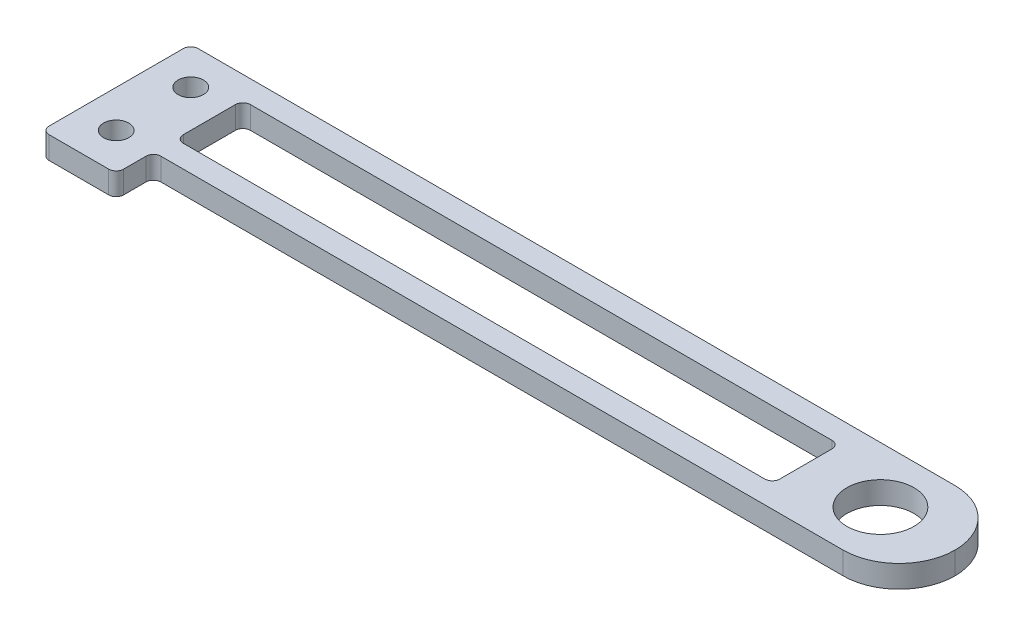
ISO-10303-21;
HEADER;
FILE_DESCRIPTION(('STEP AP214'),'2;1');
FILE_NAME('part.step','',(''),(''),'','','');
FILE_SCHEMA(('AUTOMOTIVE_DESIGN { 1 0 10303 214 1 1 1 1 }'));
ENDSEC;
DATA;
#1=APPLICATION_CONTEXT('core data for automotive mechanical design processes');
#2=APPLICATION_PROTOCOL_DEFINITION('international standard','automotive_design',2000,#1);
#3=PRODUCT_CONTEXT('',#1,'mechanical');
#4=PRODUCT('Part','Part','',(#3));
#5=PRODUCT_RELATED_PRODUCT_CATEGORY('part','',(#4));
#6=PRODUCT_DEFINITION_FORMATION('','',#4);
#7=PRODUCT_DEFINITION_CONTEXT('part definition',#1,'design');
#8=PRODUCT_DEFINITION('design','',#6,#7);
#9=PRODUCT_DEFINITION_SHAPE('','',#8);
#10=(LENGTH_UNIT() NAMED_UNIT(*) SI_UNIT(.MILLI.,.METRE.));
#11=(NAMED_UNIT(*) PLANE_ANGLE_UNIT() SI_UNIT($,.RADIAN.));
#12=(NAMED_UNIT(*) SI_UNIT($,.STERADIAN.) SOLID_ANGLE_UNIT());
#13=UNCERTAINTY_MEASURE_WITH_UNIT(LENGTH_MEASURE(1.E-05),#10,'distance_accuracy_value','');
#14=(GEOMETRIC_REPRESENTATION_CONTEXT(3) GLOBAL_UNCERTAINTY_ASSIGNED_CONTEXT((#13)) GLOBAL_UNIT_ASSIGNED_CONTEXT((#10,
#11,#12)) REPRESENTATION_CONTEXT('',''));
#15=CARTESIAN_POINT('',(0.,0.,0.));
#16=DIRECTION('',(0.,0.,1.));
#17=DIRECTION('',(1.,0.,0.));
#18=AXIS2_PLACEMENT_3D('',#15,#16,#17);
#19=CARTESIAN_POINT('',(10.,3.,0.));
#20=DIRECTION('',(0.,0.,-1.));
#21=DIRECTION('',(-1.,0.,0.));
#22=AXIS2_PLACEMENT_3D('',#19,#20,#21);
#23=PLANE('',#22);
#24=DIRECTION('',(1.,0.,0.));
#25=VECTOR('',#24,1.);
#26=CARTESIAN_POINT('',(10.,3.,0.));
#27=LINE('',#26,#25);
#28=CARTESIAN_POINT('',(0.999999999999999,3.,0.));
#29=VERTEX_POINT('',#28);
#30=CARTESIAN_POINT('',(9.,3.,0.));
#31=VERTEX_POINT('',#30);
#32=EDGE_CURVE('E183',#29,#31,#27,.T.);
#33=ORIENTED_EDGE('',*,*,#32,.F.);
#34=DIRECTION('',(0.,-1.,0.));
#35=VECTOR('',#34,1.);
#36=CARTESIAN_POINT('',(0.999999999999999,3.,0.));
#37=LINE('',#36,#35);
#38=CARTESIAN_POINT('',(0.999999999999999,0.,0.));
#39=VERTEX_POINT('',#38);
#40=EDGE_CURVE('E168',#29,#39,#37,.T.);
#41=ORIENTED_EDGE('',*,*,#40,.T.);
#42=DIRECTION('',(1.,0.,0.));
#43=VECTOR('',#42,1.);
#44=CARTESIAN_POINT('',(10.,0.,0.));
#45=LINE('',#44,#43);
#46=CARTESIAN_POINT('',(9.,0.,0.));
#47=VERTEX_POINT('',#46);
#48=EDGE_CURVE('E180',#39,#47,#45,.T.);
#49=ORIENTED_EDGE('',*,*,#48,.T.);
#50=DIRECTION('',(0.,-1.,0.));
#51=VECTOR('',#50,1.);
#52=CARTESIAN_POINT('',(9.,3.,0.));
#53=LINE('',#52,#51);
#54=EDGE_CURVE('E185',#47,#31,#53,.F.);
#55=ORIENTED_EDGE('',*,*,#54,.T.);
#56=EDGE_LOOP('',(#33,#41,#49,#55));
#57=FACE_BOUND('',#56,.T.);
#58=ADVANCED_FACE('F33',(#57),#23,.F.);
#59=CARTESIAN_POINT('',(9.99999999999999,3.,-4.99999999999999));
#60=DIRECTION('',(-1.,0.,0.));
#61=DIRECTION('',(0.,0.,1.));
#62=AXIS2_PLACEMENT_3D('',#59,#60,#61);
#63=PLANE('',#62);
#64=DIRECTION('',(0.,0.,-1.));
#65=VECTOR('',#64,1.);
#66=CARTESIAN_POINT('',(9.99999999999999,0.,-4.99999999999999));
#67=LINE('',#66,#65);
#68=CARTESIAN_POINT('',(10.,0.,-1.));
#69=VERTEX_POINT('',#68);
#70=CARTESIAN_POINT('',(10.,0.,-3.99999999999999));
#71=VERTEX_POINT('',#70);
#72=EDGE_CURVE('E190',#69,#71,#67,.T.);
#73=ORIENTED_EDGE('',*,*,#72,.T.);
#74=DIRECTION('',(0.,-1.,0.));
#75=VECTOR('',#74,1.);
#76=CARTESIAN_POINT('',(10.,3.,-3.99999999999999));
#77=LINE('',#76,#75);
#78=CARTESIAN_POINT('',(10.,3.,-3.99999999999999));
#79=VERTEX_POINT('',#78);
#80=EDGE_CURVE('E228',#71,#79,#77,.F.);
#81=ORIENTED_EDGE('',*,*,#80,.T.);
#82=DIRECTION('',(0.,0.,-1.));
#83=VECTOR('',#82,1.);
#84=CARTESIAN_POINT('',(9.99999999999999,3.,-4.99999999999999));
#85=LINE('',#84,#83);
#86=CARTESIAN_POINT('',(10.,3.,-1.));
#87=VERTEX_POINT('',#86);
#88=EDGE_CURVE('E335',#87,#79,#85,.T.);
#89=ORIENTED_EDGE('',*,*,#88,.F.);
#90=DIRECTION('',(0.,-1.,0.));
#91=VECTOR('',#90,1.);
#92=CARTESIAN_POINT('',(10.,3.,-1.));
#93=LINE('',#92,#91);
#94=EDGE_CURVE('E225',#87,#69,#93,.T.);
#95=ORIENTED_EDGE('',*,*,#94,.T.);
#96=EDGE_LOOP('',(#73,#81,#89,#95));
#97=FACE_BOUND('',#96,.T.);
#98=ADVANCED_FACE('F374',(#97),#63,.F.);
#99=CARTESIAN_POINT('',(110.,3.,-5.));
#100=DIRECTION('',(0.,0.,-1.));
#101=DIRECTION('',(-1.,0.,0.));
#102=AXIS2_PLACEMENT_3D('',#99,#100,#101);
#103=PLANE('',#102);
#104=DIRECTION('',(1.,0.,0.));
#105=VECTOR('',#104,1.);
#106=CARTESIAN_POINT('',(110.,0.,-5.));
#107=LINE('',#106,#105);
#108=CARTESIAN_POINT('',(11.,0.,-4.99999999999999));
#109=VERTEX_POINT('',#108);
#110=CARTESIAN_POINT('',(102.5,0.,-5.));
#111=VERTEX_POINT('',#110);
#112=EDGE_CURVE('E194',#109,#111,#107,.T.);
#113=ORIENTED_EDGE('',*,*,#112,.T.);
#114=DIRECTION('',(0.,-1.,0.));
#115=VECTOR('',#114,1.);
#116=CARTESIAN_POINT('',(102.5,3.,-5.));
#117=LINE('',#116,#115);
#118=CARTESIAN_POINT('',(102.5,3.,-5.));
#119=VERTEX_POINT('',#118);
#120=EDGE_CURVE('E248',#111,#119,#117,.F.);
#121=ORIENTED_EDGE('',*,*,#120,.T.);
#122=DIRECTION('',(1.,0.,0.));
#123=VECTOR('',#122,1.);
#124=CARTESIAN_POINT('',(110.,3.,-5.));
#125=LINE('',#124,#123);
#126=CARTESIAN_POINT('',(11.,3.,-4.99999999999999));
#127=VERTEX_POINT('',#126);
#128=EDGE_CURVE('E338',#127,#119,#125,.T.);
#129=ORIENTED_EDGE('',*,*,#128,.F.);
#130=DIRECTION('',(0.,-1.,0.));
#131=VECTOR('',#130,1.);
#132=CARTESIAN_POINT('',(11.,0.,-4.99999999999999));
#133=LINE('',#132,#131);
#134=EDGE_CURVE('E222',#127,#109,#133,.T.);
#135=ORIENTED_EDGE('',*,*,#134,.T.);
#136=EDGE_LOOP('',(#113,#121,#129,#135));
#137=FACE_BOUND('',#136,.T.);
#138=ADVANCED_FACE('F366',(#137),#103,.F.);
#139=CARTESIAN_POINT('',(0.,3.,-20.));
#140=DIRECTION('',(0.,0.,1.));
#141=DIRECTION('',(1.,0.,0.));
#142=AXIS2_PLACEMENT_3D('',#139,#140,#141);
#143=PLANE('',#142);
#144=DIRECTION('',(-1.,0.,0.));
#145=VECTOR('',#144,1.);
#146=CARTESIAN_POINT('',(0.,3.,-20.));
#147=LINE('',#146,#145);
#148=CARTESIAN_POINT('',(102.5,3.,-20.));
#149=VERTEX_POINT('',#148);
#150=CARTESIAN_POINT('',(1.,3.,-20.));
#151=VERTEX_POINT('',#150);
#152=EDGE_CURVE('E340',#149,#151,#147,.T.);
#153=ORIENTED_EDGE('',*,*,#152,.F.);
#154=DIRECTION('',(0.,-1.,0.));
#155=VECTOR('',#154,1.);
#156=CARTESIAN_POINT('',(102.5,3.,-20.));
#157=LINE('',#156,#155);
#158=CARTESIAN_POINT('',(102.5,0.,-20.));
#159=VERTEX_POINT('',#158);
#160=EDGE_CURVE('E237',#149,#159,#157,.T.);
#161=ORIENTED_EDGE('',*,*,#160,.T.);
#162=DIRECTION('',(-1.,0.,0.));
#163=VECTOR('',#162,1.);
#164=CARTESIAN_POINT('',(0.,0.,-20.));
#165=LINE('',#164,#163);
#166=CARTESIAN_POINT('',(1.,0.,-20.));
#167=VERTEX_POINT('',#166);
#168=EDGE_CURVE('E205',#159,#167,#165,.T.);
#169=ORIENTED_EDGE('',*,*,#168,.T.);
#170=DIRECTION('',(0.,-1.,0.));
#171=VECTOR('',#170,1.);
#172=CARTESIAN_POINT('',(1.,3.,-20.));
#173=LINE('',#172,#171);
#174=EDGE_CURVE('E230',#167,#151,#173,.F.);
#175=ORIENTED_EDGE('',*,*,#174,.T.);
#176=EDGE_LOOP('',(#153,#161,#169,#175));
#177=FACE_BOUND('',#176,.T.);
#178=ADVANCED_FACE('F354',(#177),#143,.F.);
#179=CARTESIAN_POINT('',(0.,3.,0.));
#180=DIRECTION('',(1.,0.,0.));
#181=DIRECTION('',(0.,0.,-1.));
#182=AXIS2_PLACEMENT_3D('',#179,#180,#181);
#183=PLANE('',#182);
#184=DIRECTION('',(0.,0.,1.));
#185=VECTOR('',#184,1.);
#186=CARTESIAN_POINT('',(0.,0.,0.));
#187=LINE('',#186,#185);
#188=CARTESIAN_POINT('',(0.,0.,-19.));
#189=VERTEX_POINT('',#188);
#190=CARTESIAN_POINT('',(0.,0.,-1.));
#191=VERTEX_POINT('',#190);
#192=EDGE_CURVE('E207',#189,#191,#187,.T.);
#193=ORIENTED_EDGE('',*,*,#192,.T.);
#194=DIRECTION('',(0.,-1.,0.));
#195=VECTOR('',#194,1.);
#196=CARTESIAN_POINT('',(0.,3.,-1.));
#197=LINE('',#196,#195);
#198=CARTESIAN_POINT('',(0.,3.,-1.));
#199=VERTEX_POINT('',#198);
#200=EDGE_CURVE('E169',#191,#199,#197,.F.);
#201=ORIENTED_EDGE('',*,*,#200,.T.);
#202=DIRECTION('',(0.,0.,1.));
#203=VECTOR('',#202,1.);
#204=CARTESIAN_POINT('',(0.,3.,0.));
#205=LINE('',#204,#203);
#206=CARTESIAN_POINT('',(0.,3.,-19.));
#207=VERTEX_POINT('',#206);
#208=EDGE_CURVE('E200',#207,#199,#205,.T.);
#209=ORIENTED_EDGE('',*,*,#208,.F.);
#210=DIRECTION('',(0.,-1.,0.));
#211=VECTOR('',#210,1.);
#212=CARTESIAN_POINT('',(0.,3.,-19.));
#213=LINE('',#212,#211);
#214=EDGE_CURVE('E174',#207,#189,#213,.T.);
#215=ORIENTED_EDGE('',*,*,#214,.T.);
#216=EDGE_LOOP('',(#193,#201,#209,#215));
#217=FACE_BOUND('',#216,.T.);
#218=ADVANCED_FACE('F348',(#217),#183,.F.);
#219=CARTESIAN_POINT('',(0.,3.,0.));
#220=DIRECTION('',(0.,-1.,0.));
#221=DIRECTION('',(0.,0.,-1.));
#222=AXIS2_PLACEMENT_3D('',#219,#220,#221);
#223=PLANE('',#222);
#224=DIRECTION('',(1.,0.,0.));
#225=VECTOR('',#224,1.);
#226=CARTESIAN_POINT('',(10.,3.,-7.99999999999999));
#227=LINE('',#226,#225);
#228=CARTESIAN_POINT('',(11.,3.,-7.99999999999999));
#229=VERTEX_POINT('',#228);
#230=CARTESIAN_POINT('',(89.,3.,-7.99999999999999));
#231=VERTEX_POINT('',#230);
#232=EDGE_CURVE('E316',#229,#231,#227,.T.);
#233=ORIENTED_EDGE('',*,*,#232,.F.);
#234=CARTESIAN_POINT('',(11.,3.,-8.99999999999999));
#235=DIRECTION('',(0.,-1.,0.));
#236=DIRECTION('',(0.,0.,-1.));
#237=AXIS2_PLACEMENT_3D('',#234,#235,#236);
#238=CIRCLE('',#237,1.);
#239=CARTESIAN_POINT('',(10.,3.,-8.99999999999999));
#240=VERTEX_POINT('',#239);
#241=EDGE_CURVE('E282',#229,#240,#238,.T.);
#242=ORIENTED_EDGE('',*,*,#241,.T.);
#243=DIRECTION('',(0.,0.,1.));
#244=VECTOR('',#243,1.);
#245=CARTESIAN_POINT('',(10.,3.,-17.));
#246=LINE('',#245,#244);
#247=CARTESIAN_POINT('',(10.,3.,-16.));
#248=VERTEX_POINT('',#247);
#249=EDGE_CURVE('E293',#248,#240,#246,.T.);
#250=ORIENTED_EDGE('',*,*,#249,.F.);
#251=CARTESIAN_POINT('',(11.,3.,-16.));
#252=DIRECTION('',(0.,-1.,0.));
#253=DIRECTION('',(0.,0.,-1.));
#254=AXIS2_PLACEMENT_3D('',#251,#252,#253);
#255=CIRCLE('',#254,1.);
#256=CARTESIAN_POINT('',(11.,3.,-17.));
#257=VERTEX_POINT('',#256);
#258=EDGE_CURVE('E41',#248,#257,#255,.T.);
#259=ORIENTED_EDGE('',*,*,#258,.T.);
#260=DIRECTION('',(-1.,0.,0.));
#261=VECTOR('',#260,1.);
#262=CARTESIAN_POINT('',(10.,3.,-17.));
#263=LINE('',#262,#261);
#264=CARTESIAN_POINT('',(89.,3.,-17.));
#265=VERTEX_POINT('',#264);
#266=EDGE_CURVE('E292',#265,#257,#263,.T.);
#267=ORIENTED_EDGE('',*,*,#266,.F.);
#268=CARTESIAN_POINT('',(89.,3.,-16.));
#269=DIRECTION('',(0.,-1.,0.));
#270=DIRECTION('',(0.,0.,-1.));
#271=AXIS2_PLACEMENT_3D('',#268,#269,#270);
#272=CIRCLE('',#271,1.);
#273=CARTESIAN_POINT('',(90.,3.,-16.));
#274=VERTEX_POINT('',#273);
#275=EDGE_CURVE('E278',#265,#274,#272,.T.);
#276=ORIENTED_EDGE('',*,*,#275,.T.);
#277=DIRECTION('',(0.,0.,-1.));
#278=VECTOR('',#277,1.);
#279=CARTESIAN_POINT('',(90.,3.,-17.));
#280=LINE('',#279,#278);
#281=CARTESIAN_POINT('',(90.,3.,-8.99999999999999));
#282=VERTEX_POINT('',#281);
#283=EDGE_CURVE('E302',#282,#274,#280,.T.);
#284=ORIENTED_EDGE('',*,*,#283,.F.);
#285=CARTESIAN_POINT('',(89.,3.,-8.99999999999999));
#286=DIRECTION('',(0.,-1.,0.));
#287=DIRECTION('',(0.,0.,-1.));
#288=AXIS2_PLACEMENT_3D('',#285,#286,#287);
#289=CIRCLE('',#288,1.);
#290=EDGE_CURVE('E274',#282,#231,#289,.T.);
#291=ORIENTED_EDGE('',*,*,#290,.T.);
#292=EDGE_LOOP('',(#233,#242,#250,#259,#267,#276,#284,#291));
#293=FACE_BOUND('',#292,.T.);
#294=CARTESIAN_POINT('',(5.,3.,-15.));
#295=DIRECTION('',(0.,1.,0.));
#296=DIRECTION('',(0.,0.,1.));
#297=AXIS2_PLACEMENT_3D('',#294,#295,#296);
#298=CIRCLE('',#297,1.7);
#299=CARTESIAN_POINT('',(5.,3.,-13.3));
#300=VERTEX_POINT('',#299);
#301=EDGE_CURVE('E254',#300,#300,#298,.T.);
#302=ORIENTED_EDGE('',*,*,#301,.F.);
#303=EDGE_LOOP('',(#302));
#304=FACE_BOUND('',#303,.T.);
#305=CARTESIAN_POINT('',(5.,3.,-5.));
#306=DIRECTION('',(0.,1.,0.));
#307=DIRECTION('',(0.,0.,1.));
#308=AXIS2_PLACEMENT_3D('',#305,#306,#307);
#309=CIRCLE('',#308,1.7);
#310=CARTESIAN_POINT('',(5.,3.,-3.3));
#311=VERTEX_POINT('',#310);
#312=EDGE_CURVE('E326',#311,#311,#309,.T.);
#313=ORIENTED_EDGE('',*,*,#312,.F.);
#314=EDGE_LOOP('',(#313));
#315=FACE_BOUND('',#314,.T.);
#316=CARTESIAN_POINT('',(100.,3.,-12.5));
#317=DIRECTION('',(0.,1.,0.));
#318=DIRECTION('',(0.,0.,1.));
#319=AXIS2_PLACEMENT_3D('',#316,#317,#318);
#320=CIRCLE('',#319,4.49999999999999);
#321=CARTESIAN_POINT('',(100.,3.,-8.00000000000001));
#322=VERTEX_POINT('',#321);
#323=EDGE_CURVE('E197',#322,#322,#320,.T.);
#324=ORIENTED_EDGE('',*,*,#323,.F.);
#325=EDGE_LOOP('',(#324));
#326=FACE_BOUND('',#325,.T.);
#327=CARTESIAN_POINT('',(102.5,3.,-12.5));
#328=DIRECTION('',(0.,-1.,0.));
#329=DIRECTION('',(0.,0.,-1.));
#330=AXIS2_PLACEMENT_3D('',#327,#328,#329);
#331=CIRCLE('',#330,7.5);
#332=CARTESIAN_POINT('',(110.,3.,-12.5));
#333=VERTEX_POINT('',#332);
#334=EDGE_CURVE('E244',#119,#333,#331,.F.);
#335=ORIENTED_EDGE('',*,*,#334,.T.);
#336=CARTESIAN_POINT('',(102.5,3.,-12.5));
#337=DIRECTION('',(0.,-1.,0.));
#338=DIRECTION('',(0.,0.,-1.));
#339=AXIS2_PLACEMENT_3D('',#336,#337,#338);
#340=CIRCLE('',#339,7.5);
#341=EDGE_CURVE('E246',#333,#149,#340,.F.);
#342=ORIENTED_EDGE('',*,*,#341,.T.);
#343=ORIENTED_EDGE('',*,*,#152,.T.);
#344=CARTESIAN_POINT('',(1.,3.,-19.));
#345=DIRECTION('',(0.,-1.,0.));
#346=DIRECTION('',(0.,0.,-1.));
#347=AXIS2_PLACEMENT_3D('',#344,#345,#346);
#348=CIRCLE('',#347,1.);
#349=EDGE_CURVE('E218',#151,#207,#348,.F.);
#350=ORIENTED_EDGE('',*,*,#349,.T.);
#351=ORIENTED_EDGE('',*,*,#208,.T.);
#352=CARTESIAN_POINT('',(0.999999999999999,3.,-1.));
#353=DIRECTION('',(0.,-1.,0.));
#354=DIRECTION('',(0.,0.,-1.));
#355=AXIS2_PLACEMENT_3D('',#352,#353,#354);
#356=CIRCLE('',#355,1.);
#357=EDGE_CURVE('E220',#199,#29,#356,.F.);
#358=ORIENTED_EDGE('',*,*,#357,.T.);
#359=ORIENTED_EDGE('',*,*,#32,.T.);
#360=CARTESIAN_POINT('',(9.,3.,-1.));
#361=DIRECTION('',(0.,-1.,0.));
#362=DIRECTION('',(0.,0.,-1.));
#363=AXIS2_PLACEMENT_3D('',#360,#361,#362);
#364=CIRCLE('',#363,1.);
#365=EDGE_CURVE('E216',#31,#87,#364,.F.);
#366=ORIENTED_EDGE('',*,*,#365,.T.);
#367=ORIENTED_EDGE('',*,*,#88,.T.);
#368=CARTESIAN_POINT('',(11.,3.,-3.99999999999999));
#369=DIRECTION('',(0.,-1.,0.));
#370=DIRECTION('',(0.,0.,-1.));
#371=AXIS2_PLACEMENT_3D('',#368,#369,#370);
#372=CIRCLE('',#371,1.);
#373=EDGE_CURVE('E235',#79,#127,#372,.T.);
#374=ORIENTED_EDGE('',*,*,#373,.T.);
#375=ORIENTED_EDGE('',*,*,#128,.T.);
#376=EDGE_LOOP('',(#335,#342,#343,#350,#351,#358,#359,#366,#367,#374,#375));
#377=FACE_BOUND('',#376,.T.);
#378=ADVANCED_FACE('F290',(#293,#304,#315,#326,#377),#223,.F.);
#379=CARTESIAN_POINT('',(0.,0.,0.));
#380=DIRECTION('',(0.,-1.,0.));
#381=DIRECTION('',(0.,0.,-1.));
#382=AXIS2_PLACEMENT_3D('',#379,#380,#381);
#383=PLANE('',#382);
#384=DIRECTION('',(-1.,0.,0.));
#385=VECTOR('',#384,1.);
#386=CARTESIAN_POINT('',(10.,0.,-17.));
#387=LINE('',#386,#385);
#388=CARTESIAN_POINT('',(89.,0.,-17.));
#389=VERTEX_POINT('',#388);
#390=CARTESIAN_POINT('',(11.,0.,-17.));
#391=VERTEX_POINT('',#390);
#392=EDGE_CURVE('E255',#389,#391,#387,.T.);
#393=ORIENTED_EDGE('',*,*,#392,.T.);
#394=CARTESIAN_POINT('',(11.,0.,-16.));
#395=DIRECTION('',(0.,-1.,0.));
#396=DIRECTION('',(0.,0.,-1.));
#397=AXIS2_PLACEMENT_3D('',#394,#395,#396);
#398=CIRCLE('',#397,1.);
#399=CARTESIAN_POINT('',(10.,0.,-16.));
#400=VERTEX_POINT('',#399);
#401=EDGE_CURVE('E11',#391,#400,#398,.F.);
#402=ORIENTED_EDGE('',*,*,#401,.T.);
#403=DIRECTION('',(0.,0.,1.));
#404=VECTOR('',#403,1.);
#405=CARTESIAN_POINT('',(10.,0.,-17.));
#406=LINE('',#405,#404);
#407=CARTESIAN_POINT('',(10.,0.,-8.99999999999999));
#408=VERTEX_POINT('',#407);
#409=EDGE_CURVE('E301',#400,#408,#406,.T.);
#410=ORIENTED_EDGE('',*,*,#409,.T.);
#411=CARTESIAN_POINT('',(11.,0.,-8.99999999999999));
#412=DIRECTION('',(0.,-1.,0.));
#413=DIRECTION('',(0.,0.,-1.));
#414=AXIS2_PLACEMENT_3D('',#411,#412,#413);
#415=CIRCLE('',#414,1.);
#416=CARTESIAN_POINT('',(11.,0.,-7.99999999999999));
#417=VERTEX_POINT('',#416);
#418=EDGE_CURVE('E284',#408,#417,#415,.F.);
#419=ORIENTED_EDGE('',*,*,#418,.T.);
#420=DIRECTION('',(1.,0.,0.));
#421=VECTOR('',#420,1.);
#422=CARTESIAN_POINT('',(10.,0.,-7.99999999999999));
#423=LINE('',#422,#421);
#424=CARTESIAN_POINT('',(89.,0.,-7.99999999999999));
#425=VERTEX_POINT('',#424);
#426=EDGE_CURVE('E306',#417,#425,#423,.T.);
#427=ORIENTED_EDGE('',*,*,#426,.T.);
#428=CARTESIAN_POINT('',(89.,0.,-8.99999999999999));
#429=DIRECTION('',(0.,-1.,0.));
#430=DIRECTION('',(0.,0.,-1.));
#431=AXIS2_PLACEMENT_3D('',#428,#429,#430);
#432=CIRCLE('',#431,1.);
#433=CARTESIAN_POINT('',(90.,0.,-8.99999999999999));
#434=VERTEX_POINT('',#433);
#435=EDGE_CURVE('E276',#425,#434,#432,.F.);
#436=ORIENTED_EDGE('',*,*,#435,.T.);
#437=DIRECTION('',(0.,0.,-1.));
#438=VECTOR('',#437,1.);
#439=CARTESIAN_POINT('',(90.,0.,-17.));
#440=LINE('',#439,#438);
#441=CARTESIAN_POINT('',(90.,0.,-16.));
#442=VERTEX_POINT('',#441);
#443=EDGE_CURVE('E309',#434,#442,#440,.T.);
#444=ORIENTED_EDGE('',*,*,#443,.T.);
#445=CARTESIAN_POINT('',(89.,0.,-16.));
#446=DIRECTION('',(0.,-1.,0.));
#447=DIRECTION('',(0.,0.,-1.));
#448=AXIS2_PLACEMENT_3D('',#445,#446,#447);
#449=CIRCLE('',#448,1.);
#450=EDGE_CURVE('E280',#442,#389,#449,.F.);
#451=ORIENTED_EDGE('',*,*,#450,.T.);
#452=EDGE_LOOP('',(#393,#402,#410,#419,#427,#436,#444,#451));
#453=FACE_BOUND('',#452,.T.);
#454=CARTESIAN_POINT('',(5.,0.,-15.));
#455=DIRECTION('',(0.,1.,0.));
#456=DIRECTION('',(0.,0.,1.));
#457=AXIS2_PLACEMENT_3D('',#454,#455,#456);
#458=CIRCLE('',#457,1.7);
#459=CARTESIAN_POINT('',(5.,0.,-13.3));
#460=VERTEX_POINT('',#459);
#461=EDGE_CURVE('E323',#460,#460,#458,.T.);
#462=ORIENTED_EDGE('',*,*,#461,.T.);
#463=EDGE_LOOP('',(#462));
#464=FACE_BOUND('',#463,.T.);
#465=CARTESIAN_POINT('',(5.,0.,-5.));
#466=DIRECTION('',(0.,1.,0.));
#467=DIRECTION('',(0.,0.,1.));
#468=AXIS2_PLACEMENT_3D('',#465,#466,#467);
#469=CIRCLE('',#468,1.7);
#470=CARTESIAN_POINT('',(5.,0.,-3.3));
#471=VERTEX_POINT('',#470);
#472=EDGE_CURVE('E329',#471,#471,#469,.T.);
#473=ORIENTED_EDGE('',*,*,#472,.T.);
#474=EDGE_LOOP('',(#473));
#475=FACE_BOUND('',#474,.T.);
#476=CARTESIAN_POINT('',(100.,0.,-12.5));
#477=DIRECTION('',(0.,1.,0.));
#478=DIRECTION('',(0.,0.,1.));
#479=AXIS2_PLACEMENT_3D('',#476,#477,#478);
#480=CIRCLE('',#479,4.5);
#481=CARTESIAN_POINT('',(100.,0.,-8.));
#482=VERTEX_POINT('',#481);
#483=EDGE_CURVE('E191',#482,#482,#480,.T.);
#484=ORIENTED_EDGE('',*,*,#483,.T.);
#485=EDGE_LOOP('',(#484));
#486=FACE_BOUND('',#485,.T.);
#487=ORIENTED_EDGE('',*,*,#168,.F.);
#488=CARTESIAN_POINT('',(102.5,0.,-12.5));
#489=DIRECTION('',(0.,-1.,0.));
#490=DIRECTION('',(0.,0.,-1.));
#491=AXIS2_PLACEMENT_3D('',#488,#489,#490);
#492=CIRCLE('',#491,7.5);
#493=CARTESIAN_POINT('',(110.,0.,-12.5));
#494=VERTEX_POINT('',#493);
#495=EDGE_CURVE('E242',#159,#494,#492,.T.);
#496=ORIENTED_EDGE('',*,*,#495,.T.);
#497=CARTESIAN_POINT('',(102.5,0.,-12.5));
#498=DIRECTION('',(0.,-1.,0.));
#499=DIRECTION('',(0.,0.,-1.));
#500=AXIS2_PLACEMENT_3D('',#497,#498,#499);
#501=CIRCLE('',#500,7.5);
#502=EDGE_CURVE('E240',#494,#111,#501,.T.);
#503=ORIENTED_EDGE('',*,*,#502,.T.);
#504=ORIENTED_EDGE('',*,*,#112,.F.);
#505=CARTESIAN_POINT('',(11.,0.,-3.99999999999999));
#506=DIRECTION('',(0.,-1.,0.));
#507=DIRECTION('',(0.,0.,-1.));
#508=AXIS2_PLACEMENT_3D('',#505,#506,#507);
#509=CIRCLE('',#508,1.);
#510=EDGE_CURVE('E233',#109,#71,#509,.F.);
#511=ORIENTED_EDGE('',*,*,#510,.T.);
#512=ORIENTED_EDGE('',*,*,#72,.F.);
#513=CARTESIAN_POINT('',(9.,0.,-1.));
#514=DIRECTION('',(0.,-1.,0.));
#515=DIRECTION('',(0.,0.,-1.));
#516=AXIS2_PLACEMENT_3D('',#513,#514,#515);
#517=CIRCLE('',#516,1.);
#518=EDGE_CURVE('E184',#69,#47,#517,.T.);
#519=ORIENTED_EDGE('',*,*,#518,.T.);
#520=ORIENTED_EDGE('',*,*,#48,.F.);
#521=CARTESIAN_POINT('',(0.999999999999999,0.,-1.));
#522=DIRECTION('',(0.,-1.,0.));
#523=DIRECTION('',(0.,0.,-1.));
#524=AXIS2_PLACEMENT_3D('',#521,#522,#523);
#525=CIRCLE('',#524,1.);
#526=EDGE_CURVE('E164',#39,#191,#525,.T.);
#527=ORIENTED_EDGE('',*,*,#526,.T.);
#528=ORIENTED_EDGE('',*,*,#192,.F.);
#529=CARTESIAN_POINT('',(1.,0.,-19.));
#530=DIRECTION('',(0.,-1.,0.));
#531=DIRECTION('',(0.,0.,-1.));
#532=AXIS2_PLACEMENT_3D('',#529,#530,#531);
#533=CIRCLE('',#532,1.);
#534=EDGE_CURVE('E175',#189,#167,#533,.T.);
#535=ORIENTED_EDGE('',*,*,#534,.T.);
#536=EDGE_LOOP('',(#487,#496,#503,#504,#511,#512,#519,#520,#527,#528,#535));
#537=FACE_BOUND('',#536,.T.);
#538=ADVANCED_FACE('F188',(#453,#464,#475,#486,#537),#383,.T.);
#539=CARTESIAN_POINT('',(100.,3.,-12.5));
#540=DIRECTION('',(0.,1.,0.));
#541=DIRECTION('',(0.,0.,1.));
#542=AXIS2_PLACEMENT_3D('',#539,#540,#541);
#543=CYLINDRICAL_SURFACE('',#542,4.5);
#544=ORIENTED_EDGE('',*,*,#483,.F.);
#545=EDGE_LOOP('',(#544));
#546=FACE_BOUND('',#545,.T.);
#547=ORIENTED_EDGE('',*,*,#323,.T.);
#548=EDGE_LOOP('',(#547));
#549=FACE_BOUND('',#548,.T.);
#550=ADVANCED_FACE('F464',(#546,#549),#543,.F.);
#551=CARTESIAN_POINT('',(5.,3.,-5.));
#552=DIRECTION('',(0.,1.,0.));
#553=DIRECTION('',(0.,0.,1.));
#554=AXIS2_PLACEMENT_3D('',#551,#552,#553);
#555=CYLINDRICAL_SURFACE('',#554,1.7);
#556=ORIENTED_EDGE('',*,*,#472,.F.);
#557=EDGE_LOOP('',(#556));
#558=FACE_BOUND('',#557,.T.);
#559=ORIENTED_EDGE('',*,*,#312,.T.);
#560=EDGE_LOOP('',(#559));
#561=FACE_BOUND('',#560,.T.);
#562=ADVANCED_FACE('F557',(#558,#561),#555,.F.);
#563=CARTESIAN_POINT('',(5.,3.,-15.));
#564=DIRECTION('',(0.,1.,0.));
#565=DIRECTION('',(0.,0.,1.));
#566=AXIS2_PLACEMENT_3D('',#563,#564,#565);
#567=CYLINDRICAL_SURFACE('',#566,1.7);
#568=ORIENTED_EDGE('',*,*,#461,.F.);
#569=EDGE_LOOP('',(#568));
#570=FACE_BOUND('',#569,.T.);
#571=ORIENTED_EDGE('',*,*,#301,.T.);
#572=EDGE_LOOP('',(#571));
#573=FACE_BOUND('',#572,.T.);
#574=ADVANCED_FACE('F399',(#570,#573),#567,.F.);
#575=CARTESIAN_POINT('',(0.999999999999999,3.,-1.));
#576=DIRECTION('',(0.,-1.,0.));
#577=DIRECTION('',(0.,0.,-1.));
#578=AXIS2_PLACEMENT_3D('',#575,#576,#577);
#579=CYLINDRICAL_SURFACE('',#578,1.);
#580=ORIENTED_EDGE('',*,*,#357,.F.);
#581=ORIENTED_EDGE('',*,*,#200,.F.);
#582=ORIENTED_EDGE('',*,*,#526,.F.);
#583=ORIENTED_EDGE('',*,*,#40,.F.);
#584=EDGE_LOOP('',(#580,#581,#582,#583));
#585=FACE_BOUND('',#584,.T.);
#586=ADVANCED_FACE('F167',(#585),#579,.T.);
#587=CARTESIAN_POINT('',(11.,3.,-3.99999999999999));
#588=DIRECTION('',(0.,1.,0.));
#589=DIRECTION('',(0.,0.,1.));
#590=AXIS2_PLACEMENT_3D('',#587,#588,#589);
#591=CYLINDRICAL_SURFACE('',#590,1.);
#592=ORIENTED_EDGE('',*,*,#373,.F.);
#593=ORIENTED_EDGE('',*,*,#80,.F.);
#594=ORIENTED_EDGE('',*,*,#510,.F.);
#595=ORIENTED_EDGE('',*,*,#134,.F.);
#596=EDGE_LOOP('',(#592,#593,#594,#595));
#597=FACE_BOUND('',#596,.T.);
#598=ADVANCED_FACE('F371',(#597),#591,.F.);
#599=CARTESIAN_POINT('',(1.,3.,-19.));
#600=DIRECTION('',(0.,-1.,0.));
#601=DIRECTION('',(0.,0.,-1.));
#602=AXIS2_PLACEMENT_3D('',#599,#600,#601);
#603=CYLINDRICAL_SURFACE('',#602,1.);
#604=ORIENTED_EDGE('',*,*,#349,.F.);
#605=ORIENTED_EDGE('',*,*,#174,.F.);
#606=ORIENTED_EDGE('',*,*,#534,.F.);
#607=ORIENTED_EDGE('',*,*,#214,.F.);
#608=EDGE_LOOP('',(#604,#605,#606,#607));
#609=FACE_BOUND('',#608,.T.);
#610=ADVANCED_FACE('F350',(#609),#603,.T.);
#611=CARTESIAN_POINT('',(9.,3.,-1.));
#612=DIRECTION('',(0.,-1.,0.));
#613=DIRECTION('',(0.,0.,-1.));
#614=AXIS2_PLACEMENT_3D('',#611,#612,#613);
#615=CYLINDRICAL_SURFACE('',#614,1.);
#616=ORIENTED_EDGE('',*,*,#365,.F.);
#617=ORIENTED_EDGE('',*,*,#54,.F.);
#618=ORIENTED_EDGE('',*,*,#518,.F.);
#619=ORIENTED_EDGE('',*,*,#94,.F.);
#620=EDGE_LOOP('',(#616,#617,#618,#619));
#621=FACE_BOUND('',#620,.T.);
#622=ADVANCED_FACE('F379',(#621),#615,.T.);
#623=CARTESIAN_POINT('',(102.5,3.,-12.5));
#624=DIRECTION('',(0.,-1.,0.));
#625=DIRECTION('',(0.,0.,-1.));
#626=AXIS2_PLACEMENT_3D('',#623,#624,#625);
#627=CYLINDRICAL_SURFACE('',#626,7.5);
#628=DIRECTION('',(0.,-1.,0.));
#629=VECTOR('',#628,1.);
#630=CARTESIAN_POINT('',(110.,3.,-12.5));
#631=LINE('',#630,#629);
#632=EDGE_CURVE('E251',#333,#494,#631,.T.);
#633=ORIENTED_EDGE('',*,*,#632,.F.);
#634=ORIENTED_EDGE('',*,*,#334,.F.);
#635=ORIENTED_EDGE('',*,*,#120,.F.);
#636=ORIENTED_EDGE('',*,*,#502,.F.);
#637=EDGE_LOOP('',(#633,#634,#635,#636));
#638=FACE_BOUND('',#637,.T.);
#639=ADVANCED_FACE('F362',(#638),#627,.T.);
#640=CARTESIAN_POINT('',(102.5,3.,-12.5));
#641=DIRECTION('',(0.,-1.,0.));
#642=DIRECTION('',(0.,0.,-1.));
#643=AXIS2_PLACEMENT_3D('',#640,#641,#642);
#644=CYLINDRICAL_SURFACE('',#643,7.5);
#645=ORIENTED_EDGE('',*,*,#341,.F.);
#646=ORIENTED_EDGE('',*,*,#632,.T.);
#647=ORIENTED_EDGE('',*,*,#495,.F.);
#648=ORIENTED_EDGE('',*,*,#160,.F.);
#649=EDGE_LOOP('',(#645,#646,#647,#648));
#650=FACE_BOUND('',#649,.T.);
#651=ADVANCED_FACE('F358',(#650),#644,.T.);
#652=CARTESIAN_POINT('',(10.,0.,-17.));
#653=DIRECTION('',(-1.,0.,0.));
#654=DIRECTION('',(0.,0.,1.));
#655=AXIS2_PLACEMENT_3D('',#652,#653,#654);
#656=PLANE('',#655);
#657=ORIENTED_EDGE('',*,*,#249,.T.);
#658=DIRECTION('',(0.,1.,0.));
#659=VECTOR('',#658,1.);
#660=CARTESIAN_POINT('',(10.,0.,-8.99999999999999));
#661=LINE('',#660,#659);
#662=EDGE_CURVE('E48',#240,#408,#661,.F.);
#663=ORIENTED_EDGE('',*,*,#662,.T.);
#664=ORIENTED_EDGE('',*,*,#409,.F.);
#665=DIRECTION('',(0.,1.,0.));
#666=VECTOR('',#665,1.);
#667=CARTESIAN_POINT('',(10.,3.,-16.));
#668=LINE('',#667,#666);
#669=EDGE_CURVE('E270',#400,#248,#668,.T.);
#670=ORIENTED_EDGE('',*,*,#669,.T.);
#671=EDGE_LOOP('',(#657,#663,#664,#670));
#672=FACE_BOUND('',#671,.T.);
#673=ADVANCED_FACE('F304',(#672),#656,.F.);
#674=CARTESIAN_POINT('',(10.,0.,-17.));
#675=DIRECTION('',(0.,0.,-1.));
#676=DIRECTION('',(-1.,0.,0.));
#677=AXIS2_PLACEMENT_3D('',#674,#675,#676);
#678=PLANE('',#677);
#679=ORIENTED_EDGE('',*,*,#392,.F.);
#680=DIRECTION('',(0.,1.,0.));
#681=VECTOR('',#680,1.);
#682=CARTESIAN_POINT('',(89.,3.,-17.));
#683=LINE('',#682,#681);
#684=EDGE_CURVE('E267',#389,#265,#683,.T.);
#685=ORIENTED_EDGE('',*,*,#684,.T.);
#686=ORIENTED_EDGE('',*,*,#266,.T.);
#687=DIRECTION('',(0.,1.,0.));
#688=VECTOR('',#687,1.);
#689=CARTESIAN_POINT('',(11.,0.,-17.));
#690=LINE('',#689,#688);
#691=EDGE_CURVE('E265',#257,#391,#690,.F.);
#692=ORIENTED_EDGE('',*,*,#691,.T.);
#693=EDGE_LOOP('',(#679,#685,#686,#692));
#694=FACE_BOUND('',#693,.T.);
#695=ADVANCED_FACE('F299',(#694),#678,.F.);
#696=CARTESIAN_POINT('',(90.,0.,-17.));
#697=DIRECTION('',(1.,0.,0.));
#698=DIRECTION('',(0.,0.,-1.));
#699=AXIS2_PLACEMENT_3D('',#696,#697,#698);
#700=PLANE('',#699);
#701=ORIENTED_EDGE('',*,*,#443,.F.);
#702=DIRECTION('',(0.,1.,0.));
#703=VECTOR('',#702,1.);
#704=CARTESIAN_POINT('',(90.,3.,-8.99999999999999));
#705=LINE('',#704,#703);
#706=EDGE_CURVE('E257',#434,#282,#705,.T.);
#707=ORIENTED_EDGE('',*,*,#706,.T.);
#708=ORIENTED_EDGE('',*,*,#283,.T.);
#709=DIRECTION('',(0.,1.,0.));
#710=VECTOR('',#709,1.);
#711=CARTESIAN_POINT('',(90.,0.,-16.));
#712=LINE('',#711,#710);
#713=EDGE_CURVE('E250',#274,#442,#712,.F.);
#714=ORIENTED_EDGE('',*,*,#713,.T.);
#715=EDGE_LOOP('',(#701,#707,#708,#714));
#716=FACE_BOUND('',#715,.T.);
#717=ADVANCED_FACE('F481',(#716),#700,.F.);
#718=CARTESIAN_POINT('',(10.,0.,-7.99999999999999));
#719=DIRECTION('',(0.,0.,1.));
#720=DIRECTION('',(1.,0.,0.));
#721=AXIS2_PLACEMENT_3D('',#718,#719,#720);
#722=PLANE('',#721);
#723=ORIENTED_EDGE('',*,*,#232,.T.);
#724=DIRECTION('',(0.,1.,0.));
#725=VECTOR('',#724,1.);
#726=CARTESIAN_POINT('',(89.,0.,-7.99999999999999));
#727=LINE('',#726,#725);
#728=EDGE_CURVE('E263',#231,#425,#727,.F.);
#729=ORIENTED_EDGE('',*,*,#728,.T.);
#730=ORIENTED_EDGE('',*,*,#426,.F.);
#731=DIRECTION('',(0.,1.,0.));
#732=VECTOR('',#731,1.);
#733=CARTESIAN_POINT('',(11.,3.,-7.99999999999999));
#734=LINE('',#733,#732);
#735=EDGE_CURVE('E260',#417,#229,#734,.T.);
#736=ORIENTED_EDGE('',*,*,#735,.T.);
#737=EDGE_LOOP('',(#723,#729,#730,#736));
#738=FACE_BOUND('',#737,.T.);
#739=ADVANCED_FACE('F490',(#738),#722,.F.);
#740=CARTESIAN_POINT('',(89.,0.,-8.99999999999999));
#741=DIRECTION('',(0.,-1.,0.));
#742=DIRECTION('',(0.,0.,-1.));
#743=AXIS2_PLACEMENT_3D('',#740,#741,#742);
#744=CYLINDRICAL_SURFACE('',#743,1.);
#745=ORIENTED_EDGE('',*,*,#435,.F.);
#746=ORIENTED_EDGE('',*,*,#728,.F.);
#747=ORIENTED_EDGE('',*,*,#290,.F.);
#748=ORIENTED_EDGE('',*,*,#706,.F.);
#749=EDGE_LOOP('',(#745,#746,#747,#748));
#750=FACE_BOUND('',#749,.T.);
#751=ADVANCED_FACE('F500',(#750),#744,.F.);
#752=CARTESIAN_POINT('',(89.,0.,-16.));
#753=DIRECTION('',(0.,-1.,0.));
#754=DIRECTION('',(0.,0.,-1.));
#755=AXIS2_PLACEMENT_3D('',#752,#753,#754);
#756=CYLINDRICAL_SURFACE('',#755,1.);
#757=ORIENTED_EDGE('',*,*,#450,.F.);
#758=ORIENTED_EDGE('',*,*,#713,.F.);
#759=ORIENTED_EDGE('',*,*,#275,.F.);
#760=ORIENTED_EDGE('',*,*,#684,.F.);
#761=EDGE_LOOP('',(#757,#758,#759,#760));
#762=FACE_BOUND('',#761,.T.);
#763=ADVANCED_FACE('F510',(#762),#756,.F.);
#764=CARTESIAN_POINT('',(11.,0.,-8.99999999999999));
#765=DIRECTION('',(0.,-1.,0.));
#766=DIRECTION('',(0.,0.,-1.));
#767=AXIS2_PLACEMENT_3D('',#764,#765,#766);
#768=CYLINDRICAL_SURFACE('',#767,1.);
#769=ORIENTED_EDGE('',*,*,#418,.F.);
#770=ORIENTED_EDGE('',*,*,#662,.F.);
#771=ORIENTED_EDGE('',*,*,#241,.F.);
#772=ORIENTED_EDGE('',*,*,#735,.F.);
#773=EDGE_LOOP('',(#769,#770,#771,#772));
#774=FACE_BOUND('',#773,.T.);
#775=ADVANCED_FACE('F520',(#774),#768,.F.);
#776=CARTESIAN_POINT('',(11.,0.,-16.));
#777=DIRECTION('',(0.,-1.,0.));
#778=DIRECTION('',(0.,0.,-1.));
#779=AXIS2_PLACEMENT_3D('',#776,#777,#778);
#780=CYLINDRICAL_SURFACE('',#779,1.);
#781=ORIENTED_EDGE('',*,*,#401,.F.);
#782=ORIENTED_EDGE('',*,*,#691,.F.);
#783=ORIENTED_EDGE('',*,*,#258,.F.);
#784=ORIENTED_EDGE('',*,*,#669,.F.);
#785=EDGE_LOOP('',(#781,#782,#783,#784));
#786=FACE_BOUND('',#785,.T.);
#787=ADVANCED_FACE('F35',(#786),#780,.F.);
#788=CLOSED_SHELL('',(#58,#98,#138,#178,#218,#378,#538,#550,#562,#574,#586,#598,#610,#622,#639,
#651,#673,#695,#717,#739,#751,#763,#775,#787));
#789=MANIFOLD_SOLID_BREP('B2',#788);
#790=ADVANCED_BREP_SHAPE_REPRESENTATION('',(#18,#789),#14);
#791=SHAPE_DEFINITION_REPRESENTATION(#9,#790);
ENDSEC;
END-ISO-10303-21;
